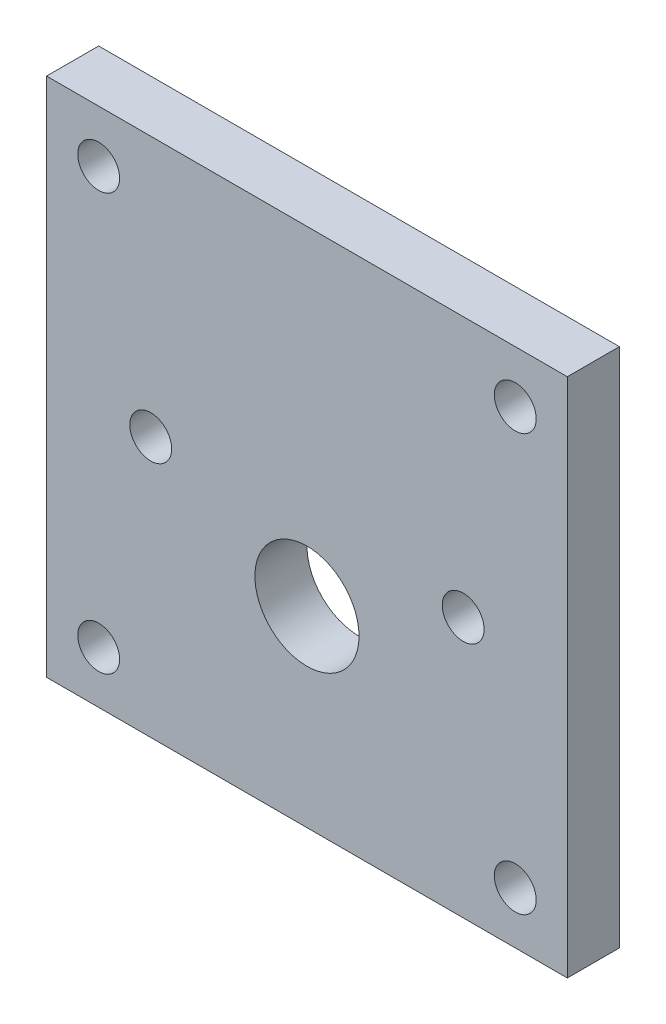
ISO-10303-21;
HEADER;
FILE_DESCRIPTION(('STEP AP214'),'2;1');
FILE_NAME('part.step','',(''),(''),'','','');
FILE_SCHEMA(('AUTOMOTIVE_DESIGN { 1 0 10303 214 1 1 1 1 }'));
ENDSEC;
DATA;
#1=APPLICATION_CONTEXT('core data for automotive mechanical design processes');
#2=APPLICATION_PROTOCOL_DEFINITION('international standard','automotive_design',2000,#1);
#3=PRODUCT_CONTEXT('',#1,'mechanical');
#4=PRODUCT('Part','Part','',(#3));
#5=PRODUCT_RELATED_PRODUCT_CATEGORY('part','',(#4));
#6=PRODUCT_DEFINITION_FORMATION('','',#4);
#7=PRODUCT_DEFINITION_CONTEXT('part definition',#1,'design');
#8=PRODUCT_DEFINITION('design','',#6,#7);
#9=PRODUCT_DEFINITION_SHAPE('','',#8);
#10=(LENGTH_UNIT() NAMED_UNIT(*) SI_UNIT(.MILLI.,.METRE.));
#11=(NAMED_UNIT(*) PLANE_ANGLE_UNIT() SI_UNIT($,.RADIAN.));
#12=(NAMED_UNIT(*) SI_UNIT($,.STERADIAN.) SOLID_ANGLE_UNIT());
#13=UNCERTAINTY_MEASURE_WITH_UNIT(LENGTH_MEASURE(1.E-05),#10,'distance_accuracy_value','');
#14=(GEOMETRIC_REPRESENTATION_CONTEXT(3) GLOBAL_UNCERTAINTY_ASSIGNED_CONTEXT((#13)) GLOBAL_UNIT_ASSIGNED_CONTEXT((#10,
#11,#12)) REPRESENTATION_CONTEXT('',''));
#15=CARTESIAN_POINT('',(0.,0.,0.));
#16=DIRECTION('',(0.,0.,1.));
#17=DIRECTION('',(1.,0.,0.));
#18=AXIS2_PLACEMENT_3D('',#15,#16,#17);
#19=CARTESIAN_POINT('',(31.75,31.75,6.35));
#20=DIRECTION('',(-1.,0.,0.));
#21=DIRECTION('',(0.,-1.,0.));
#22=AXIS2_PLACEMENT_3D('',#19,#20,#21);
#23=PLANE('',#22);
#24=DIRECTION('',(0.,1.,0.));
#25=VECTOR('',#24,1.);
#26=CARTESIAN_POINT('',(31.75,31.75,0.));
#27=LINE('',#26,#25);
#28=CARTESIAN_POINT('',(31.75,-31.75,0.));
#29=VERTEX_POINT('',#28);
#30=CARTESIAN_POINT('',(31.75,31.75,0.));
#31=VERTEX_POINT('',#30);
#32=EDGE_CURVE('E95',#29,#31,#27,.T.);
#33=ORIENTED_EDGE('',*,*,#32,.T.);
#34=DIRECTION('',(0.,0.,-1.));
#35=VECTOR('',#34,1.);
#36=CARTESIAN_POINT('',(31.75,31.75,6.35));
#37=LINE('',#36,#35);
#38=CARTESIAN_POINT('',(31.75,31.75,6.35));
#39=VERTEX_POINT('',#38);
#40=EDGE_CURVE('E11',#39,#31,#37,.T.);
#41=ORIENTED_EDGE('',*,*,#40,.F.);
#42=DIRECTION('',(0.,1.,0.));
#43=VECTOR('',#42,1.);
#44=CARTESIAN_POINT('',(31.75,31.75,6.35));
#45=LINE('',#44,#43);
#46=CARTESIAN_POINT('',(31.75,-31.75,6.35));
#47=VERTEX_POINT('',#46);
#48=EDGE_CURVE('E83',#47,#39,#45,.T.);
#49=ORIENTED_EDGE('',*,*,#48,.F.);
#50=DIRECTION('',(0.,0.,-1.));
#51=VECTOR('',#50,1.);
#52=CARTESIAN_POINT('',(31.75,-31.75,6.35));
#53=LINE('',#52,#51);
#54=EDGE_CURVE('E91',#47,#29,#53,.T.);
#55=ORIENTED_EDGE('',*,*,#54,.T.);
#56=EDGE_LOOP('',(#33,#41,#49,#55));
#57=FACE_BOUND('',#56,.T.);
#58=ADVANCED_FACE('F32',(#57),#23,.F.);
#59=CARTESIAN_POINT('',(-31.75,31.75,6.35));
#60=DIRECTION('',(0.,-1.,0.));
#61=DIRECTION('',(0.,0.,-1.));
#62=AXIS2_PLACEMENT_3D('',#59,#60,#61);
#63=PLANE('',#62);
#64=DIRECTION('',(-1.,0.,0.));
#65=VECTOR('',#64,1.);
#66=CARTESIAN_POINT('',(-31.75,31.75,0.));
#67=LINE('',#66,#65);
#68=CARTESIAN_POINT('',(-31.75,31.75,0.));
#69=VERTEX_POINT('',#68);
#70=EDGE_CURVE('E87',#31,#69,#67,.T.);
#71=ORIENTED_EDGE('',*,*,#70,.T.);
#72=DIRECTION('',(0.,0.,-1.));
#73=VECTOR('',#72,1.);
#74=CARTESIAN_POINT('',(-31.75,31.75,6.35));
#75=LINE('',#74,#73);
#76=CARTESIAN_POINT('',(-31.75,31.75,6.35));
#77=VERTEX_POINT('',#76);
#78=EDGE_CURVE('E40',#77,#69,#75,.T.);
#79=ORIENTED_EDGE('',*,*,#78,.F.);
#80=DIRECTION('',(-1.,0.,0.));
#81=VECTOR('',#80,1.);
#82=CARTESIAN_POINT('',(-31.75,31.75,6.35));
#83=LINE('',#82,#81);
#84=EDGE_CURVE('E78',#39,#77,#83,.T.);
#85=ORIENTED_EDGE('',*,*,#84,.F.);
#86=ORIENTED_EDGE('',*,*,#40,.T.);
#87=EDGE_LOOP('',(#71,#79,#85,#86));
#88=FACE_BOUND('',#87,.T.);
#89=ADVANCED_FACE('F86',(#88),#63,.F.);
#90=CARTESIAN_POINT('',(-31.75,31.75,6.35));
#91=DIRECTION('',(1.,0.,0.));
#92=DIRECTION('',(0.,0.,-1.));
#93=AXIS2_PLACEMENT_3D('',#90,#91,#92);
#94=PLANE('',#93);
#95=DIRECTION('',(0.,-1.,0.));
#96=VECTOR('',#95,1.);
#97=CARTESIAN_POINT('',(-31.75,31.75,0.));
#98=LINE('',#97,#96);
#99=CARTESIAN_POINT('',(-31.75,-31.75,0.));
#100=VERTEX_POINT('',#99);
#101=EDGE_CURVE('E65',#69,#100,#98,.T.);
#102=ORIENTED_EDGE('',*,*,#101,.T.);
#103=DIRECTION('',(0.,0.,-1.));
#104=VECTOR('',#103,1.);
#105=CARTESIAN_POINT('',(-31.75,-31.75,6.35));
#106=LINE('',#105,#104);
#107=CARTESIAN_POINT('',(-31.75,-31.75,6.35));
#108=VERTEX_POINT('',#107);
#109=EDGE_CURVE('E88',#108,#100,#106,.T.);
#110=ORIENTED_EDGE('',*,*,#109,.F.);
#111=DIRECTION('',(0.,-1.,0.));
#112=VECTOR('',#111,1.);
#113=CARTESIAN_POINT('',(-31.75,31.75,6.35));
#114=LINE('',#113,#112);
#115=EDGE_CURVE('E81',#77,#108,#114,.T.);
#116=ORIENTED_EDGE('',*,*,#115,.F.);
#117=ORIENTED_EDGE('',*,*,#78,.T.);
#118=EDGE_LOOP('',(#102,#110,#116,#117));
#119=FACE_BOUND('',#118,.T.);
#120=ADVANCED_FACE('F89',(#119),#94,.F.);
#121=CARTESIAN_POINT('',(-31.75,-31.75,6.35));
#122=DIRECTION('',(0.,1.,0.));
#123=DIRECTION('',(0.,0.,1.));
#124=AXIS2_PLACEMENT_3D('',#121,#122,#123);
#125=PLANE('',#124);
#126=DIRECTION('',(1.,0.,0.));
#127=VECTOR('',#126,1.);
#128=CARTESIAN_POINT('',(-31.75,-31.75,0.));
#129=LINE('',#128,#127);
#130=EDGE_CURVE('E71',#100,#29,#129,.T.);
#131=ORIENTED_EDGE('',*,*,#130,.T.);
#132=ORIENTED_EDGE('',*,*,#54,.F.);
#133=DIRECTION('',(1.,0.,0.));
#134=VECTOR('',#133,1.);
#135=CARTESIAN_POINT('',(-31.75,-31.75,6.35));
#136=LINE('',#135,#134);
#137=EDGE_CURVE('E48',#108,#47,#136,.T.);
#138=ORIENTED_EDGE('',*,*,#137,.F.);
#139=ORIENTED_EDGE('',*,*,#109,.T.);
#140=EDGE_LOOP('',(#131,#132,#138,#139));
#141=FACE_BOUND('',#140,.T.);
#142=ADVANCED_FACE('F103',(#141),#125,.F.);
#143=CARTESIAN_POINT('',(0.,0.,6.35));
#144=DIRECTION('',(0.,0.,1.));
#145=DIRECTION('',(1.,0.,0.));
#146=AXIS2_PLACEMENT_3D('',#143,#144,#145);
#147=PLANE('',#146);
#148=CARTESIAN_POINT('',(0.,-8.3566,6.35));
#149=DIRECTION('',(0.,0.,1.));
#150=DIRECTION('',(1.,0.,0.));
#151=AXIS2_PLACEMENT_3D('',#148,#149,#150);
#152=CIRCLE('',#151,6.35000000000001);
#153=CARTESIAN_POINT('',(6.35000000000001,-8.3566,6.35));
#154=VERTEX_POINT('',#153);
#155=EDGE_CURVE('E147',#154,#154,#152,.T.);
#156=ORIENTED_EDGE('',*,*,#155,.F.);
#157=EDGE_LOOP('',(#156));
#158=FACE_BOUND('',#157,.T.);
#159=CARTESIAN_POINT('',(-19.05,0.,6.35));
#160=DIRECTION('',(0.,0.,1.));
#161=DIRECTION('',(1.,0.,0.));
#162=AXIS2_PLACEMENT_3D('',#159,#160,#161);
#163=CIRCLE('',#162,2.55269999999999);
#164=CARTESIAN_POINT('',(-16.4973,0.,6.35));
#165=VERTEX_POINT('',#164);
#166=EDGE_CURVE('E141',#165,#165,#163,.T.);
#167=ORIENTED_EDGE('',*,*,#166,.F.);
#168=EDGE_LOOP('',(#167));
#169=FACE_BOUND('',#168,.T.);
#170=CARTESIAN_POINT('',(19.05,0.,6.35));
#171=DIRECTION('',(0.,0.,1.));
#172=DIRECTION('',(1.,0.,0.));
#173=AXIS2_PLACEMENT_3D('',#170,#171,#172);
#174=CIRCLE('',#173,2.55269999999999);
#175=CARTESIAN_POINT('',(21.6027,0.,6.35));
#176=VERTEX_POINT('',#175);
#177=EDGE_CURVE('E135',#176,#176,#174,.T.);
#178=ORIENTED_EDGE('',*,*,#177,.F.);
#179=EDGE_LOOP('',(#178));
#180=FACE_BOUND('',#179,.T.);
#181=CARTESIAN_POINT('',(-25.4,25.4,6.35));
#182=DIRECTION('',(0.,0.,1.));
#183=DIRECTION('',(1.,0.,0.));
#184=AXIS2_PLACEMENT_3D('',#181,#182,#183);
#185=CIRCLE('',#184,2.55269999999999);
#186=CARTESIAN_POINT('',(-22.8473,25.4,6.35));
#187=VERTEX_POINT('',#186);
#188=EDGE_CURVE('E129',#187,#187,#185,.T.);
#189=ORIENTED_EDGE('',*,*,#188,.F.);
#190=EDGE_LOOP('',(#189));
#191=FACE_BOUND('',#190,.T.);
#192=CARTESIAN_POINT('',(25.4,-25.4,6.35));
#193=DIRECTION('',(0.,0.,1.));
#194=DIRECTION('',(1.,0.,0.));
#195=AXIS2_PLACEMENT_3D('',#192,#193,#194);
#196=CIRCLE('',#195,2.55269999999999);
#197=CARTESIAN_POINT('',(27.9527,-25.4,6.35));
#198=VERTEX_POINT('',#197);
#199=EDGE_CURVE('E123',#198,#198,#196,.T.);
#200=ORIENTED_EDGE('',*,*,#199,.F.);
#201=EDGE_LOOP('',(#200));
#202=FACE_BOUND('',#201,.T.);
#203=CARTESIAN_POINT('',(-25.4,-25.4,6.35));
#204=DIRECTION('',(0.,0.,1.));
#205=DIRECTION('',(1.,0.,0.));
#206=AXIS2_PLACEMENT_3D('',#203,#204,#205);
#207=CIRCLE('',#206,2.55269999999999);
#208=CARTESIAN_POINT('',(-22.8473,-25.4,6.35));
#209=VERTEX_POINT('',#208);
#210=EDGE_CURVE('E117',#209,#209,#207,.T.);
#211=ORIENTED_EDGE('',*,*,#210,.F.);
#212=EDGE_LOOP('',(#211));
#213=FACE_BOUND('',#212,.T.);
#214=CARTESIAN_POINT('',(25.4,25.4,6.35));
#215=DIRECTION('',(0.,0.,1.));
#216=DIRECTION('',(1.,0.,0.));
#217=AXIS2_PLACEMENT_3D('',#214,#215,#216);
#218=CIRCLE('',#217,2.55269999999999);
#219=CARTESIAN_POINT('',(27.9527,25.4,6.35));
#220=VERTEX_POINT('',#219);
#221=EDGE_CURVE('E111',#220,#220,#218,.T.);
#222=ORIENTED_EDGE('',*,*,#221,.F.);
#223=EDGE_LOOP('',(#222));
#224=FACE_BOUND('',#223,.T.);
#225=ORIENTED_EDGE('',*,*,#48,.T.);
#226=ORIENTED_EDGE('',*,*,#84,.T.);
#227=ORIENTED_EDGE('',*,*,#115,.T.);
#228=ORIENTED_EDGE('',*,*,#137,.T.);
#229=EDGE_LOOP('',(#225,#226,#227,#228));
#230=FACE_BOUND('',#229,.T.);
#231=ADVANCED_FACE('F79',(#158,#169,#180,#191,#202,#213,#224,#230),#147,.T.);
#232=CARTESIAN_POINT('',(0.,0.,0.));
#233=DIRECTION('',(0.,0.,1.));
#234=DIRECTION('',(1.,0.,0.));
#235=AXIS2_PLACEMENT_3D('',#232,#233,#234);
#236=PLANE('',#235);
#237=CARTESIAN_POINT('',(0.,-8.3566,0.));
#238=DIRECTION('',(0.,0.,1.));
#239=DIRECTION('',(1.,0.,0.));
#240=AXIS2_PLACEMENT_3D('',#237,#238,#239);
#241=CIRCLE('',#240,6.35000000000001);
#242=CARTESIAN_POINT('',(6.35000000000001,-8.3566,0.));
#243=VERTEX_POINT('',#242);
#244=EDGE_CURVE('E144',#243,#243,#241,.T.);
#245=ORIENTED_EDGE('',*,*,#244,.T.);
#246=EDGE_LOOP('',(#245));
#247=FACE_BOUND('',#246,.T.);
#248=CARTESIAN_POINT('',(-19.05,0.,0.));
#249=DIRECTION('',(0.,0.,1.));
#250=DIRECTION('',(1.,0.,0.));
#251=AXIS2_PLACEMENT_3D('',#248,#249,#250);
#252=CIRCLE('',#251,2.55269999999999);
#253=CARTESIAN_POINT('',(-16.4973,0.,0.));
#254=VERTEX_POINT('',#253);
#255=EDGE_CURVE('E138',#254,#254,#252,.T.);
#256=ORIENTED_EDGE('',*,*,#255,.T.);
#257=EDGE_LOOP('',(#256));
#258=FACE_BOUND('',#257,.T.);
#259=CARTESIAN_POINT('',(19.05,0.,0.));
#260=DIRECTION('',(0.,0.,1.));
#261=DIRECTION('',(1.,0.,0.));
#262=AXIS2_PLACEMENT_3D('',#259,#260,#261);
#263=CIRCLE('',#262,2.55269999999999);
#264=CARTESIAN_POINT('',(21.6027,0.,0.));
#265=VERTEX_POINT('',#264);
#266=EDGE_CURVE('E132',#265,#265,#263,.T.);
#267=ORIENTED_EDGE('',*,*,#266,.T.);
#268=EDGE_LOOP('',(#267));
#269=FACE_BOUND('',#268,.T.);
#270=CARTESIAN_POINT('',(-25.4,25.4,0.));
#271=DIRECTION('',(0.,0.,1.));
#272=DIRECTION('',(1.,0.,0.));
#273=AXIS2_PLACEMENT_3D('',#270,#271,#272);
#274=CIRCLE('',#273,2.55269999999999);
#275=CARTESIAN_POINT('',(-22.8473,25.4,0.));
#276=VERTEX_POINT('',#275);
#277=EDGE_CURVE('E126',#276,#276,#274,.T.);
#278=ORIENTED_EDGE('',*,*,#277,.T.);
#279=EDGE_LOOP('',(#278));
#280=FACE_BOUND('',#279,.T.);
#281=CARTESIAN_POINT('',(25.4,-25.4,0.));
#282=DIRECTION('',(0.,0.,1.));
#283=DIRECTION('',(1.,0.,0.));
#284=AXIS2_PLACEMENT_3D('',#281,#282,#283);
#285=CIRCLE('',#284,2.55269999999999);
#286=CARTESIAN_POINT('',(27.9527,-25.4,0.));
#287=VERTEX_POINT('',#286);
#288=EDGE_CURVE('E120',#287,#287,#285,.T.);
#289=ORIENTED_EDGE('',*,*,#288,.T.);
#290=EDGE_LOOP('',(#289));
#291=FACE_BOUND('',#290,.T.);
#292=CARTESIAN_POINT('',(-25.4,-25.4,0.));
#293=DIRECTION('',(0.,0.,1.));
#294=DIRECTION('',(1.,0.,0.));
#295=AXIS2_PLACEMENT_3D('',#292,#293,#294);
#296=CIRCLE('',#295,2.55269999999999);
#297=CARTESIAN_POINT('',(-22.8473,-25.4,0.));
#298=VERTEX_POINT('',#297);
#299=EDGE_CURVE('E114',#298,#298,#296,.T.);
#300=ORIENTED_EDGE('',*,*,#299,.T.);
#301=EDGE_LOOP('',(#300));
#302=FACE_BOUND('',#301,.T.);
#303=CARTESIAN_POINT('',(25.4,25.4,0.));
#304=DIRECTION('',(0.,0.,1.));
#305=DIRECTION('',(1.,0.,0.));
#306=AXIS2_PLACEMENT_3D('',#303,#304,#305);
#307=CIRCLE('',#306,2.55269999999999);
#308=CARTESIAN_POINT('',(27.9527,25.4,0.));
#309=VERTEX_POINT('',#308);
#310=EDGE_CURVE('E98',#309,#309,#307,.T.);
#311=ORIENTED_EDGE('',*,*,#310,.T.);
#312=EDGE_LOOP('',(#311));
#313=FACE_BOUND('',#312,.T.);
#314=ORIENTED_EDGE('',*,*,#32,.F.);
#315=ORIENTED_EDGE('',*,*,#130,.F.);
#316=ORIENTED_EDGE('',*,*,#101,.F.);
#317=ORIENTED_EDGE('',*,*,#70,.F.);
#318=EDGE_LOOP('',(#314,#315,#316,#317));
#319=FACE_BOUND('',#318,.T.);
#320=ADVANCED_FACE('F106',(#247,#258,#269,#280,#291,#302,#313,#319),#236,.F.);
#321=CARTESIAN_POINT('',(25.4,25.4,6.35));
#322=DIRECTION('',(0.,0.,1.));
#323=DIRECTION('',(1.,0.,0.));
#324=AXIS2_PLACEMENT_3D('',#321,#322,#323);
#325=CYLINDRICAL_SURFACE('',#324,2.55269999999999);
#326=ORIENTED_EDGE('',*,*,#310,.F.);
#327=EDGE_LOOP('',(#326));
#328=FACE_BOUND('',#327,.T.);
#329=ORIENTED_EDGE('',*,*,#221,.T.);
#330=EDGE_LOOP('',(#329));
#331=FACE_BOUND('',#330,.T.);
#332=ADVANCED_FACE('F168',(#328,#331),#325,.F.);
#333=CARTESIAN_POINT('',(-25.4,-25.4,6.35));
#334=DIRECTION('',(0.,0.,1.));
#335=DIRECTION('',(1.,0.,0.));
#336=AXIS2_PLACEMENT_3D('',#333,#334,#335);
#337=CYLINDRICAL_SURFACE('',#336,2.55269999999999);
#338=ORIENTED_EDGE('',*,*,#299,.F.);
#339=EDGE_LOOP('',(#338));
#340=FACE_BOUND('',#339,.T.);
#341=ORIENTED_EDGE('',*,*,#210,.T.);
#342=EDGE_LOOP('',(#341));
#343=FACE_BOUND('',#342,.T.);
#344=ADVANCED_FACE('F170',(#340,#343),#337,.F.);
#345=CARTESIAN_POINT('',(25.4,-25.4,6.35));
#346=DIRECTION('',(0.,0.,1.));
#347=DIRECTION('',(1.,0.,0.));
#348=AXIS2_PLACEMENT_3D('',#345,#346,#347);
#349=CYLINDRICAL_SURFACE('',#348,2.55269999999999);
#350=ORIENTED_EDGE('',*,*,#288,.F.);
#351=EDGE_LOOP('',(#350));
#352=FACE_BOUND('',#351,.T.);
#353=ORIENTED_EDGE('',*,*,#199,.T.);
#354=EDGE_LOOP('',(#353));
#355=FACE_BOUND('',#354,.T.);
#356=ADVANCED_FACE('F177',(#352,#355),#349,.F.);
#357=CARTESIAN_POINT('',(-25.4,25.4,6.35));
#358=DIRECTION('',(0.,0.,1.));
#359=DIRECTION('',(1.,0.,0.));
#360=AXIS2_PLACEMENT_3D('',#357,#358,#359);
#361=CYLINDRICAL_SURFACE('',#360,2.55269999999999);
#362=ORIENTED_EDGE('',*,*,#277,.F.);
#363=EDGE_LOOP('',(#362));
#364=FACE_BOUND('',#363,.T.);
#365=ORIENTED_EDGE('',*,*,#188,.T.);
#366=EDGE_LOOP('',(#365));
#367=FACE_BOUND('',#366,.T.);
#368=ADVANCED_FACE('F232',(#364,#367),#361,.F.);
#369=CARTESIAN_POINT('',(19.05,0.,6.35));
#370=DIRECTION('',(0.,0.,1.));
#371=DIRECTION('',(1.,0.,0.));
#372=AXIS2_PLACEMENT_3D('',#369,#370,#371);
#373=CYLINDRICAL_SURFACE('',#372,2.55269999999999);
#374=ORIENTED_EDGE('',*,*,#266,.F.);
#375=EDGE_LOOP('',(#374));
#376=FACE_BOUND('',#375,.T.);
#377=ORIENTED_EDGE('',*,*,#177,.T.);
#378=EDGE_LOOP('',(#377));
#379=FACE_BOUND('',#378,.T.);
#380=ADVANCED_FACE('F225',(#376,#379),#373,.F.);
#381=CARTESIAN_POINT('',(-19.05,0.,6.35));
#382=DIRECTION('',(0.,0.,1.));
#383=DIRECTION('',(1.,0.,0.));
#384=AXIS2_PLACEMENT_3D('',#381,#382,#383);
#385=CYLINDRICAL_SURFACE('',#384,2.55269999999999);
#386=ORIENTED_EDGE('',*,*,#255,.F.);
#387=EDGE_LOOP('',(#386));
#388=FACE_BOUND('',#387,.T.);
#389=ORIENTED_EDGE('',*,*,#166,.T.);
#390=EDGE_LOOP('',(#389));
#391=FACE_BOUND('',#390,.T.);
#392=ADVANCED_FACE('F215',(#388,#391),#385,.F.);
#393=CARTESIAN_POINT('',(0.,-8.3566,6.35));
#394=DIRECTION('',(0.,0.,1.));
#395=DIRECTION('',(1.,0.,0.));
#396=AXIS2_PLACEMENT_3D('',#393,#394,#395);
#397=CYLINDRICAL_SURFACE('',#396,6.35000000000001);
#398=ORIENTED_EDGE('',*,*,#244,.F.);
#399=EDGE_LOOP('',(#398));
#400=FACE_BOUND('',#399,.T.);
#401=ORIENTED_EDGE('',*,*,#155,.T.);
#402=EDGE_LOOP('',(#401));
#403=FACE_BOUND('',#402,.T.);
#404=ADVANCED_FACE('F151',(#400,#403),#397,.F.);
#405=CLOSED_SHELL('',(#58,#89,#120,#142,#231,#320,#332,#344,#356,#368,#380,#392,#404));
#406=MANIFOLD_SOLID_BREP('B2',#405);
#407=ADVANCED_BREP_SHAPE_REPRESENTATION('',(#18,#406),#14);
#408=SHAPE_DEFINITION_REPRESENTATION(#9,#407);
ENDSEC;
END-ISO-10303-21;
